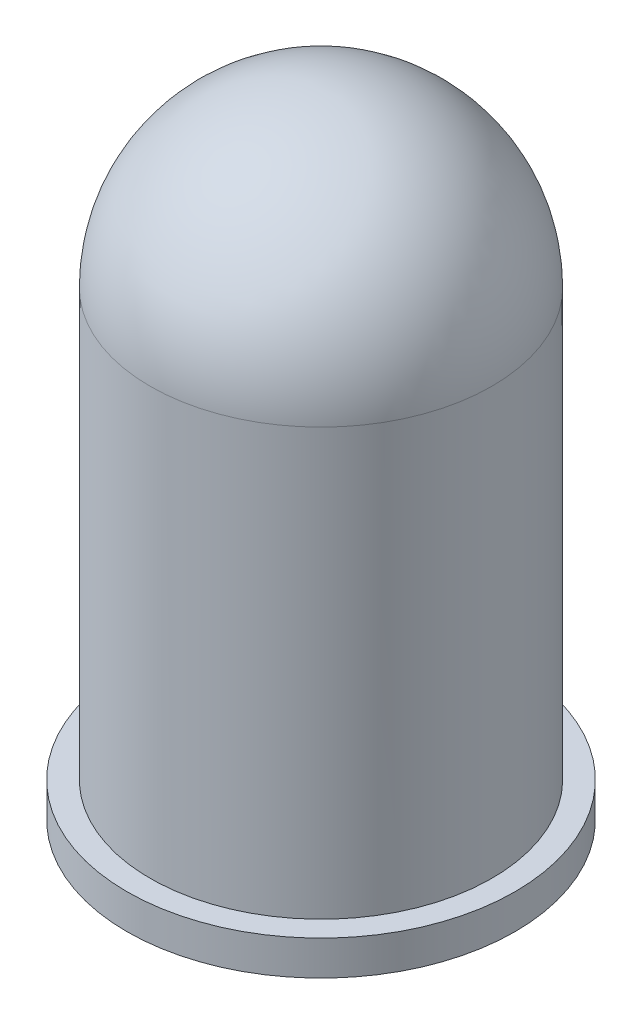
ISO-10303-21;
HEADER;
FILE_DESCRIPTION(('STEP AP214'),'2;1');
FILE_NAME('part.step','',(''),(''),'','','');
FILE_SCHEMA(('AUTOMOTIVE_DESIGN { 1 0 10303 214 1 1 1 1 }'));
ENDSEC;
DATA;
#1=APPLICATION_CONTEXT('core data for automotive mechanical design processes');
#2=APPLICATION_PROTOCOL_DEFINITION('international standard','automotive_design',2000,#1);
#3=PRODUCT_CONTEXT('',#1,'mechanical');
#4=PRODUCT('Part','Part','',(#3));
#5=PRODUCT_RELATED_PRODUCT_CATEGORY('part','',(#4));
#6=PRODUCT_DEFINITION_FORMATION('','',#4);
#7=PRODUCT_DEFINITION_CONTEXT('part definition',#1,'design');
#8=PRODUCT_DEFINITION('design','',#6,#7);
#9=PRODUCT_DEFINITION_SHAPE('','',#8);
#10=(LENGTH_UNIT() NAMED_UNIT(*) SI_UNIT(.MILLI.,.METRE.));
#11=(NAMED_UNIT(*) PLANE_ANGLE_UNIT() SI_UNIT($,.RADIAN.));
#12=(NAMED_UNIT(*) SI_UNIT($,.STERADIAN.) SOLID_ANGLE_UNIT());
#13=UNCERTAINTY_MEASURE_WITH_UNIT(LENGTH_MEASURE(1.E-05),#10,'distance_accuracy_value','');
#14=(GEOMETRIC_REPRESENTATION_CONTEXT(3) GLOBAL_UNCERTAINTY_ASSIGNED_CONTEXT((#13)) GLOBAL_UNIT_ASSIGNED_CONTEXT((#10,
#11,#12)) REPRESENTATION_CONTEXT('',''));
#15=CARTESIAN_POINT('',(0.,0.,0.));
#16=DIRECTION('',(0.,0.,1.));
#17=DIRECTION('',(1.,0.,0.));
#18=AXIS2_PLACEMENT_3D('',#15,#16,#17);
#19=CARTESIAN_POINT('',(0.,18.2773970596356,0.));
#20=DIRECTION('',(0.,-1.,0.));
#21=DIRECTION('',(-1.,0.,0.));
#22=AXIS2_PLACEMENT_3D('',#19,#20,#21);
#23=SPHERICAL_SURFACE('',#22,24.6620246694065);
#24=CARTESIAN_POINT('',(0.,18.2773970596355,0.));
#25=DIRECTION('',(0.,-1.,0.));
#26=DIRECTION('',(0.,0.,-1.));
#27=AXIS2_PLACEMENT_3D('',#24,#25,#26);
#28=CIRCLE('',#27,24.6620246694065);
#29=CARTESIAN_POINT('',(0.,18.2773970596355,-24.6620246694065));
#30=VERTEX_POINT('',#29);
#31=EDGE_CURVE('E11',#30,#30,#28,.T.);
#32=ORIENTED_EDGE('',*,*,#31,.F.);
#33=EDGE_LOOP('',(#32));
#34=FACE_BOUND('',#33,.T.);
#35=ADVANCED_FACE('F33',(#34),#23,.T.);
#36=CARTESIAN_POINT('',(0.,-43.2199609111002,0.));
#37=DIRECTION('',(0.,-1.,0.));
#38=DIRECTION('',(0.,0.,-1.));
#39=AXIS2_PLACEMENT_3D('',#36,#37,#38);
#40=CYLINDRICAL_SURFACE('',#39,24.6620246694065);
#41=CARTESIAN_POINT('',(0.,-43.2199609111002,0.));
#42=DIRECTION('',(0.,-1.,0.));
#43=DIRECTION('',(0.,0.,-1.));
#44=AXIS2_PLACEMENT_3D('',#41,#42,#43);
#45=CIRCLE('',#44,24.6620246694065);
#46=CARTESIAN_POINT('',(0.,-43.2199609111002,-24.6620246694065));
#47=VERTEX_POINT('',#46);
#48=EDGE_CURVE('E40',#47,#47,#45,.T.);
#49=ORIENTED_EDGE('',*,*,#48,.F.);
#50=EDGE_LOOP('',(#49));
#51=FACE_BOUND('',#50,.T.);
#52=ORIENTED_EDGE('',*,*,#31,.T.);
#53=EDGE_LOOP('',(#52));
#54=FACE_BOUND('',#53,.T.);
#55=ADVANCED_FACE('F121',(#51,#54),#40,.T.);
#56=CARTESIAN_POINT('',(0.,-48.2199609111002,0.));
#57=DIRECTION('',(0.,1.,0.));
#58=DIRECTION('',(0.,0.,1.));
#59=AXIS2_PLACEMENT_3D('',#56,#57,#58);
#60=CYLINDRICAL_SURFACE('',#59,28.);
#61=CARTESIAN_POINT('',(0.,-48.2199609111002,0.));
#62=DIRECTION('',(0.,-1.,0.));
#63=DIRECTION('',(0.,0.,-1.));
#64=AXIS2_PLACEMENT_3D('',#61,#62,#63);
#65=CIRCLE('',#64,28.);
#66=CARTESIAN_POINT('',(0.,-48.2199609111002,-28.));
#67=VERTEX_POINT('',#66);
#68=EDGE_CURVE('E111',#67,#67,#65,.T.);
#69=ORIENTED_EDGE('',*,*,#68,.F.);
#70=EDGE_LOOP('',(#69));
#71=FACE_BOUND('',#70,.T.);
#72=CARTESIAN_POINT('',(0.,-43.2199609111002,0.));
#73=DIRECTION('',(0.,-1.,0.));
#74=DIRECTION('',(0.,0.,-1.));
#75=AXIS2_PLACEMENT_3D('',#72,#73,#74);
#76=CIRCLE('',#75,28.);
#77=CARTESIAN_POINT('',(0.,-43.2199609111002,-28.));
#78=VERTEX_POINT('',#77);
#79=EDGE_CURVE('E108',#78,#78,#76,.T.);
#80=ORIENTED_EDGE('',*,*,#79,.T.);
#81=EDGE_LOOP('',(#80));
#82=FACE_BOUND('',#81,.T.);
#83=ADVANCED_FACE('F124',(#71,#82),#60,.T.);
#84=CARTESIAN_POINT('',(0.,-48.2199609111002,0.));
#85=DIRECTION('',(0.,-1.,0.));
#86=DIRECTION('',(0.,0.,-1.));
#87=AXIS2_PLACEMENT_3D('',#84,#85,#86);
#88=PLANE('',#87);
#89=DIRECTION('',(0.,0.,-1.));
#90=VECTOR('',#89,1.);
#91=CARTESIAN_POINT('',(-2.5,-48.2199609111002,-10.));
#92=LINE('',#91,#90);
#93=CARTESIAN_POINT('',(-2.5,-48.2199609111002,10.));
#94=VERTEX_POINT('',#93);
#95=CARTESIAN_POINT('',(-2.5,-48.2199609111002,-10.));
#96=VERTEX_POINT('',#95);
#97=EDGE_CURVE('E47',#94,#96,#92,.T.);
#98=ORIENTED_EDGE('',*,*,#97,.F.);
#99=DIRECTION('',(-1.,0.,0.));
#100=VECTOR('',#99,1.);
#101=CARTESIAN_POINT('',(2.5,-48.2199609111002,10.));
#102=LINE('',#101,#100);
#103=CARTESIAN_POINT('',(2.5,-48.2199609111002,10.));
#104=VERTEX_POINT('',#103);
#105=EDGE_CURVE('E98',#104,#94,#102,.T.);
#106=ORIENTED_EDGE('',*,*,#105,.F.);
#107=DIRECTION('',(0.,0.,1.));
#108=VECTOR('',#107,1.);
#109=CARTESIAN_POINT('',(2.5,-48.2199609111002,-10.));
#110=LINE('',#109,#108);
#111=CARTESIAN_POINT('',(2.5,-48.2199609111002,-10.));
#112=VERTEX_POINT('',#111);
#113=EDGE_CURVE('E104',#112,#104,#110,.T.);
#114=ORIENTED_EDGE('',*,*,#113,.F.);
#115=DIRECTION('',(1.,0.,0.));
#116=VECTOR('',#115,1.);
#117=CARTESIAN_POINT('',(2.5,-48.2199609111002,-10.));
#118=LINE('',#117,#116);
#119=EDGE_CURVE('E82',#96,#112,#118,.T.);
#120=ORIENTED_EDGE('',*,*,#119,.F.);
#121=EDGE_LOOP('',(#98,#106,#114,#120));
#122=FACE_BOUND('',#121,.T.);
#123=ORIENTED_EDGE('',*,*,#68,.T.);
#124=EDGE_LOOP('',(#123));
#125=FACE_BOUND('',#124,.T.);
#126=ADVANCED_FACE('F140',(#122,#125),#88,.T.);
#127=CARTESIAN_POINT('',(0.,-43.2199609111002,0.));
#128=DIRECTION('',(0.,-1.,0.));
#129=DIRECTION('',(0.,0.,-1.));
#130=AXIS2_PLACEMENT_3D('',#127,#128,#129);
#131=PLANE('',#130);
#132=ORIENTED_EDGE('',*,*,#48,.T.);
#133=EDGE_LOOP('',(#132));
#134=FACE_BOUND('',#133,.T.);
#135=ORIENTED_EDGE('',*,*,#79,.F.);
#136=EDGE_LOOP('',(#135));
#137=FACE_BOUND('',#136,.T.);
#138=ADVANCED_FACE('F118',(#134,#137),#131,.F.);
#139=CARTESIAN_POINT('',(-2.5,-38.2199609111002,-10.));
#140=DIRECTION('',(-1.,0.,0.));
#141=DIRECTION('',(0.,0.,1.));
#142=AXIS2_PLACEMENT_3D('',#139,#140,#141);
#143=PLANE('',#142);
#144=ORIENTED_EDGE('',*,*,#97,.T.);
#145=DIRECTION('',(0.,-1.,0.));
#146=VECTOR('',#145,1.);
#147=CARTESIAN_POINT('',(-2.5,-38.2199609111002,-10.));
#148=LINE('',#147,#146);
#149=CARTESIAN_POINT('',(-2.5,-38.2199609111002,-10.));
#150=VERTEX_POINT('',#149);
#151=EDGE_CURVE('E70',#150,#96,#148,.T.);
#152=ORIENTED_EDGE('',*,*,#151,.F.);
#153=DIRECTION('',(0.,0.,-1.));
#154=VECTOR('',#153,1.);
#155=CARTESIAN_POINT('',(-2.5,-38.2199609111002,-10.));
#156=LINE('',#155,#154);
#157=CARTESIAN_POINT('',(-2.5,-38.2199609111002,10.));
#158=VERTEX_POINT('',#157);
#159=EDGE_CURVE('E96',#158,#150,#156,.T.);
#160=ORIENTED_EDGE('',*,*,#159,.F.);
#161=DIRECTION('',(0.,-1.,0.));
#162=VECTOR('',#161,1.);
#163=CARTESIAN_POINT('',(-2.5,-38.2199609111002,10.));
#164=LINE('',#163,#162);
#165=EDGE_CURVE('E55',#158,#94,#164,.T.);
#166=ORIENTED_EDGE('',*,*,#165,.T.);
#167=EDGE_LOOP('',(#144,#152,#160,#166));
#168=FACE_BOUND('',#167,.T.);
#169=ADVANCED_FACE('F156',(#168),#143,.F.);
#170=CARTESIAN_POINT('',(2.5,-38.2199609111002,10.));
#171=DIRECTION('',(0.,0.,1.));
#172=DIRECTION('',(1.,0.,0.));
#173=AXIS2_PLACEMENT_3D('',#170,#171,#172);
#174=PLANE('',#173);
#175=ORIENTED_EDGE('',*,*,#105,.T.);
#176=ORIENTED_EDGE('',*,*,#165,.F.);
#177=DIRECTION('',(-1.,0.,0.));
#178=VECTOR('',#177,1.);
#179=CARTESIAN_POINT('',(2.5,-38.2199609111002,10.));
#180=LINE('',#179,#178);
#181=CARTESIAN_POINT('',(2.5,-38.2199609111002,10.));
#182=VERTEX_POINT('',#181);
#183=EDGE_CURVE('E93',#182,#158,#180,.T.);
#184=ORIENTED_EDGE('',*,*,#183,.F.);
#185=DIRECTION('',(0.,-1.,0.));
#186=VECTOR('',#185,1.);
#187=CARTESIAN_POINT('',(2.5,-38.2199609111002,10.));
#188=LINE('',#187,#186);
#189=EDGE_CURVE('E86',#182,#104,#188,.T.);
#190=ORIENTED_EDGE('',*,*,#189,.T.);
#191=EDGE_LOOP('',(#175,#176,#184,#190));
#192=FACE_BOUND('',#191,.T.);
#193=ADVANCED_FACE('F162',(#192),#174,.F.);
#194=CARTESIAN_POINT('',(2.5,-38.2199609111002,-10.));
#195=DIRECTION('',(1.,0.,0.));
#196=DIRECTION('',(0.,0.,-1.));
#197=AXIS2_PLACEMENT_3D('',#194,#195,#196);
#198=PLANE('',#197);
#199=ORIENTED_EDGE('',*,*,#113,.T.);
#200=ORIENTED_EDGE('',*,*,#189,.F.);
#201=DIRECTION('',(0.,0.,1.));
#202=VECTOR('',#201,1.);
#203=CARTESIAN_POINT('',(2.5,-38.2199609111002,-10.));
#204=LINE('',#203,#202);
#205=CARTESIAN_POINT('',(2.5,-38.2199609111002,-10.));
#206=VERTEX_POINT('',#205);
#207=EDGE_CURVE('E89',#206,#182,#204,.T.);
#208=ORIENTED_EDGE('',*,*,#207,.F.);
#209=DIRECTION('',(0.,-1.,0.));
#210=VECTOR('',#209,1.);
#211=CARTESIAN_POINT('',(2.5,-38.2199609111002,-10.));
#212=LINE('',#211,#210);
#213=EDGE_CURVE('E75',#206,#112,#212,.T.);
#214=ORIENTED_EDGE('',*,*,#213,.T.);
#215=EDGE_LOOP('',(#199,#200,#208,#214));
#216=FACE_BOUND('',#215,.T.);
#217=ADVANCED_FACE('F90',(#216),#198,.F.);
#218=CARTESIAN_POINT('',(2.5,-38.2199609111002,-10.));
#219=DIRECTION('',(0.,0.,-1.));
#220=DIRECTION('',(-1.,0.,0.));
#221=AXIS2_PLACEMENT_3D('',#218,#219,#220);
#222=PLANE('',#221);
#223=ORIENTED_EDGE('',*,*,#119,.T.);
#224=ORIENTED_EDGE('',*,*,#213,.F.);
#225=DIRECTION('',(1.,0.,0.));
#226=VECTOR('',#225,1.);
#227=CARTESIAN_POINT('',(2.5,-38.2199609111002,-10.));
#228=LINE('',#227,#226);
#229=EDGE_CURVE('E79',#150,#206,#228,.T.);
#230=ORIENTED_EDGE('',*,*,#229,.F.);
#231=ORIENTED_EDGE('',*,*,#151,.T.);
#232=EDGE_LOOP('',(#223,#224,#230,#231));
#233=FACE_BOUND('',#232,.T.);
#234=ADVANCED_FACE('F77',(#233),#222,.F.);
#235=CARTESIAN_POINT('',(0.,-38.2199609111002,0.));
#236=DIRECTION('',(0.,-1.,0.));
#237=DIRECTION('',(0.,0.,-1.));
#238=AXIS2_PLACEMENT_3D('',#235,#236,#237);
#239=PLANE('',#238);
#240=ORIENTED_EDGE('',*,*,#159,.T.);
#241=ORIENTED_EDGE('',*,*,#229,.T.);
#242=ORIENTED_EDGE('',*,*,#207,.T.);
#243=ORIENTED_EDGE('',*,*,#183,.T.);
#244=EDGE_LOOP('',(#240,#241,#242,#243));
#245=FACE_BOUND('',#244,.T.);
#246=ADVANCED_FACE('F95',(#245),#239,.T.);
#247=CLOSED_SHELL('',(#35,#55,#83,#126,#138,#169,#193,#217,#234,#246));
#248=MANIFOLD_SOLID_BREP('B2',#247);
#249=ADVANCED_BREP_SHAPE_REPRESENTATION('',(#18,#248),#14);
#250=SHAPE_DEFINITION_REPRESENTATION(#9,#249);
ENDSEC;
END-ISO-10303-21;
